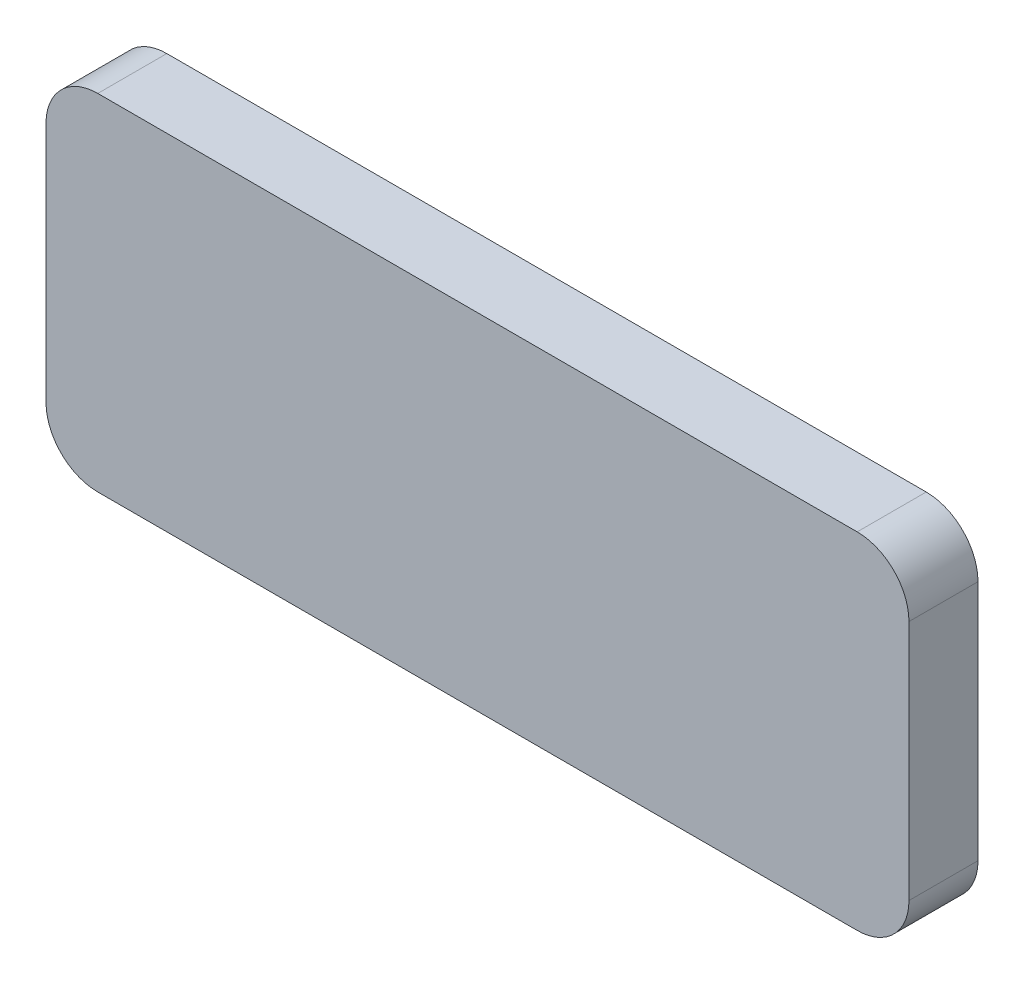
ISO-10303-21;
HEADER;
FILE_DESCRIPTION(('STEP AP214'),'2;1');
FILE_NAME('part.step','',(''),(''),'','','');
FILE_SCHEMA(('AUTOMOTIVE_DESIGN { 1 0 10303 214 1 1 1 1 }'));
ENDSEC;
DATA;
#1=APPLICATION_CONTEXT('core data for automotive mechanical design processes');
#2=APPLICATION_PROTOCOL_DEFINITION('international standard','automotive_design',2000,#1);
#3=PRODUCT_CONTEXT('',#1,'mechanical');
#4=PRODUCT('Part','Part','',(#3));
#5=PRODUCT_RELATED_PRODUCT_CATEGORY('part','',(#4));
#6=PRODUCT_DEFINITION_FORMATION('','',#4);
#7=PRODUCT_DEFINITION_CONTEXT('part definition',#1,'design');
#8=PRODUCT_DEFINITION('design','',#6,#7);
#9=PRODUCT_DEFINITION_SHAPE('','',#8);
#10=(LENGTH_UNIT() NAMED_UNIT(*) SI_UNIT(.MILLI.,.METRE.));
#11=(NAMED_UNIT(*) PLANE_ANGLE_UNIT() SI_UNIT($,.RADIAN.));
#12=(NAMED_UNIT(*) SI_UNIT($,.STERADIAN.) SOLID_ANGLE_UNIT());
#13=UNCERTAINTY_MEASURE_WITH_UNIT(LENGTH_MEASURE(1.E-05),#10,'distance_accuracy_value','');
#14=(GEOMETRIC_REPRESENTATION_CONTEXT(3) GLOBAL_UNCERTAINTY_ASSIGNED_CONTEXT((#13)) GLOBAL_UNIT_ASSIGNED_CONTEXT((#10,
#11,#12)) REPRESENTATION_CONTEXT('',''));
#15=CARTESIAN_POINT('',(0.,0.,0.));
#16=DIRECTION('',(0.,0.,1.));
#17=DIRECTION('',(1.,0.,0.));
#18=AXIS2_PLACEMENT_3D('',#15,#16,#17);
#19=CARTESIAN_POINT('',(22.,55.4011747928363,4.));
#20=DIRECTION('',(0.,0.,-1.));
#21=DIRECTION('',(-1.,0.,0.));
#22=AXIS2_PLACEMENT_3D('',#19,#20,#21);
#23=CYLINDRICAL_SURFACE('',#22,3.);
#24=CARTESIAN_POINT('',(22.,55.4011747928363,0.));
#25=DIRECTION('',(0.,0.,1.));
#26=DIRECTION('',(-1.,0.,0.));
#27=AXIS2_PLACEMENT_3D('',#24,#25,#26);
#28=CIRCLE('',#27,3.);
#29=CARTESIAN_POINT('',(25.,55.4011747928363,0.));
#30=VERTEX_POINT('',#29);
#31=CARTESIAN_POINT('',(22.,58.4011747928363,0.));
#32=VERTEX_POINT('',#31);
#33=EDGE_CURVE('E129',#30,#32,#28,.T.);
#34=ORIENTED_EDGE('',*,*,#33,.T.);
#35=DIRECTION('',(0.,0.,-1.));
#36=VECTOR('',#35,1.);
#37=CARTESIAN_POINT('',(22.,58.4011747928363,4.));
#38=LINE('',#37,#36);
#39=CARTESIAN_POINT('',(22.,58.4011747928363,4.));
#40=VERTEX_POINT('',#39);
#41=EDGE_CURVE('E11',#40,#32,#38,.T.);
#42=ORIENTED_EDGE('',*,*,#41,.F.);
#43=CARTESIAN_POINT('',(22.,55.4011747928363,4.));
#44=DIRECTION('',(0.,0.,1.));
#45=DIRECTION('',(-1.,0.,0.));
#46=AXIS2_PLACEMENT_3D('',#43,#44,#45);
#47=CIRCLE('',#46,3.);
#48=CARTESIAN_POINT('',(25.,55.4011747928363,4.));
#49=VERTEX_POINT('',#48);
#50=EDGE_CURVE('E143',#49,#40,#47,.T.);
#51=ORIENTED_EDGE('',*,*,#50,.F.);
#52=DIRECTION('',(0.,0.,-1.));
#53=VECTOR('',#52,1.);
#54=CARTESIAN_POINT('',(25.,55.4011747928363,4.));
#55=LINE('',#54,#53);
#56=EDGE_CURVE('E125',#49,#30,#55,.T.);
#57=ORIENTED_EDGE('',*,*,#56,.T.);
#58=EDGE_LOOP('',(#34,#42,#51,#57));
#59=FACE_BOUND('',#58,.T.);
#60=ADVANCED_FACE('F33',(#59),#23,.T.);
#61=CARTESIAN_POINT('',(-22.,58.4011747928363,4.));
#62=DIRECTION('',(0.,-1.,0.));
#63=DIRECTION('',(1.,0.,0.));
#64=AXIS2_PLACEMENT_3D('',#61,#62,#63);
#65=PLANE('',#64);
#66=DIRECTION('',(-1.,0.,0.));
#67=VECTOR('',#66,1.);
#68=CARTESIAN_POINT('',(-22.,58.4011747928363,0.));
#69=LINE('',#68,#67);
#70=CARTESIAN_POINT('',(-22.,58.4011747928363,0.));
#71=VERTEX_POINT('',#70);
#72=EDGE_CURVE('E132',#32,#71,#69,.T.);
#73=ORIENTED_EDGE('',*,*,#72,.T.);
#74=DIRECTION('',(0.,0.,-1.));
#75=VECTOR('',#74,1.);
#76=CARTESIAN_POINT('',(-22.,58.4011747928363,4.));
#77=LINE('',#76,#75);
#78=CARTESIAN_POINT('',(-22.,58.4011747928363,4.));
#79=VERTEX_POINT('',#78);
#80=EDGE_CURVE('E41',#79,#71,#77,.T.);
#81=ORIENTED_EDGE('',*,*,#80,.F.);
#82=DIRECTION('',(-1.,0.,0.));
#83=VECTOR('',#82,1.);
#84=CARTESIAN_POINT('',(-22.,58.4011747928363,4.));
#85=LINE('',#84,#83);
#86=EDGE_CURVE('E92',#40,#79,#85,.T.);
#87=ORIENTED_EDGE('',*,*,#86,.F.);
#88=ORIENTED_EDGE('',*,*,#41,.T.);
#89=EDGE_LOOP('',(#73,#81,#87,#88));
#90=FACE_BOUND('',#89,.T.);
#91=ADVANCED_FACE('F178',(#90),#65,.F.);
#92=CARTESIAN_POINT('',(-22.,55.4011747928363,4.));
#93=DIRECTION('',(0.,0.,-1.));
#94=DIRECTION('',(-1.,0.,0.));
#95=AXIS2_PLACEMENT_3D('',#92,#93,#94);
#96=CYLINDRICAL_SURFACE('',#95,3.);
#97=CARTESIAN_POINT('',(-22.,55.4011747928363,0.));
#98=DIRECTION('',(0.,0.,1.));
#99=DIRECTION('',(1.,0.,0.));
#100=AXIS2_PLACEMENT_3D('',#97,#98,#99);
#101=CIRCLE('',#100,3.);
#102=CARTESIAN_POINT('',(-25.,55.4011747928363,0.));
#103=VERTEX_POINT('',#102);
#104=EDGE_CURVE('E134',#71,#103,#101,.T.);
#105=ORIENTED_EDGE('',*,*,#104,.T.);
#106=DIRECTION('',(0.,0.,-1.));
#107=VECTOR('',#106,1.);
#108=CARTESIAN_POINT('',(-25.,55.4011747928363,4.));
#109=LINE('',#108,#107);
#110=CARTESIAN_POINT('',(-25.,55.4011747928363,4.));
#111=VERTEX_POINT('',#110);
#112=EDGE_CURVE('E150',#111,#103,#109,.T.);
#113=ORIENTED_EDGE('',*,*,#112,.F.);
#114=CARTESIAN_POINT('',(-22.,55.4011747928363,4.));
#115=DIRECTION('',(0.,0.,1.));
#116=DIRECTION('',(1.,0.,0.));
#117=AXIS2_PLACEMENT_3D('',#114,#115,#116);
#118=CIRCLE('',#117,3.);
#119=EDGE_CURVE('E158',#79,#111,#118,.T.);
#120=ORIENTED_EDGE('',*,*,#119,.F.);
#121=ORIENTED_EDGE('',*,*,#80,.T.);
#122=EDGE_LOOP('',(#105,#113,#120,#121));
#123=FACE_BOUND('',#122,.T.);
#124=ADVANCED_FACE('F156',(#123),#96,.T.);
#125=CARTESIAN_POINT('',(-25.,55.4011747928363,4.));
#126=DIRECTION('',(1.,0.,0.));
#127=DIRECTION('',(0.,1.,0.));
#128=AXIS2_PLACEMENT_3D('',#125,#126,#127);
#129=PLANE('',#128);
#130=DIRECTION('',(0.,-1.,0.));
#131=VECTOR('',#130,1.);
#132=CARTESIAN_POINT('',(-25.,55.4011747928363,0.));
#133=LINE('',#132,#131);
#134=CARTESIAN_POINT('',(-25.,41.4011747928363,0.));
#135=VERTEX_POINT('',#134);
#136=EDGE_CURVE('E136',#103,#135,#133,.T.);
#137=ORIENTED_EDGE('',*,*,#136,.T.);
#138=DIRECTION('',(0.,0.,-1.));
#139=VECTOR('',#138,1.);
#140=CARTESIAN_POINT('',(-25.,41.4011747928363,4.));
#141=LINE('',#140,#139);
#142=CARTESIAN_POINT('',(-25.,41.4011747928363,4.));
#143=VERTEX_POINT('',#142);
#144=EDGE_CURVE('E147',#143,#135,#141,.T.);
#145=ORIENTED_EDGE('',*,*,#144,.F.);
#146=DIRECTION('',(0.,-1.,0.));
#147=VECTOR('',#146,1.);
#148=CARTESIAN_POINT('',(-25.,55.4011747928363,4.));
#149=LINE('',#148,#147);
#150=EDGE_CURVE('E170',#111,#143,#149,.T.);
#151=ORIENTED_EDGE('',*,*,#150,.F.);
#152=ORIENTED_EDGE('',*,*,#112,.T.);
#153=EDGE_LOOP('',(#137,#145,#151,#152));
#154=FACE_BOUND('',#153,.T.);
#155=ADVANCED_FACE('F166',(#154),#129,.F.);
#156=CARTESIAN_POINT('',(-22.,41.4011747928363,4.));
#157=DIRECTION('',(0.,0.,-1.));
#158=DIRECTION('',(-1.,0.,0.));
#159=AXIS2_PLACEMENT_3D('',#156,#157,#158);
#160=CYLINDRICAL_SURFACE('',#159,3.);
#161=CARTESIAN_POINT('',(-22.,41.4011747928363,0.));
#162=DIRECTION('',(0.,0.,1.));
#163=DIRECTION('',(1.,0.,0.));
#164=AXIS2_PLACEMENT_3D('',#161,#162,#163);
#165=CIRCLE('',#164,3.);
#166=CARTESIAN_POINT('',(-22.,38.4011747928363,0.));
#167=VERTEX_POINT('',#166);
#168=EDGE_CURVE('E138',#135,#167,#165,.T.);
#169=ORIENTED_EDGE('',*,*,#168,.T.);
#170=DIRECTION('',(0.,0.,-1.));
#171=VECTOR('',#170,1.);
#172=CARTESIAN_POINT('',(-22.,38.4011747928363,4.));
#173=LINE('',#172,#171);
#174=CARTESIAN_POINT('',(-22.,38.4011747928363,4.));
#175=VERTEX_POINT('',#174);
#176=EDGE_CURVE('E120',#175,#167,#173,.T.);
#177=ORIENTED_EDGE('',*,*,#176,.F.);
#178=CARTESIAN_POINT('',(-22.,41.4011747928363,4.));
#179=DIRECTION('',(0.,0.,1.));
#180=DIRECTION('',(1.,0.,0.));
#181=AXIS2_PLACEMENT_3D('',#178,#179,#180);
#182=CIRCLE('',#181,3.);
#183=EDGE_CURVE('E111',#143,#175,#182,.T.);
#184=ORIENTED_EDGE('',*,*,#183,.F.);
#185=ORIENTED_EDGE('',*,*,#144,.T.);
#186=EDGE_LOOP('',(#169,#177,#184,#185));
#187=FACE_BOUND('',#186,.T.);
#188=ADVANCED_FACE('F169',(#187),#160,.T.);
#189=CARTESIAN_POINT('',(-22.,38.4011747928363,4.));
#190=DIRECTION('',(0.,1.,0.));
#191=DIRECTION('',(-1.,0.,0.));
#192=AXIS2_PLACEMENT_3D('',#189,#190,#191);
#193=PLANE('',#192);
#194=DIRECTION('',(1.,0.,0.));
#195=VECTOR('',#194,1.);
#196=CARTESIAN_POINT('',(-22.,38.4011747928363,0.));
#197=LINE('',#196,#195);
#198=CARTESIAN_POINT('',(22.,38.4011747928363,0.));
#199=VERTEX_POINT('',#198);
#200=EDGE_CURVE('E119',#167,#199,#197,.T.);
#201=ORIENTED_EDGE('',*,*,#200,.T.);
#202=DIRECTION('',(0.,0.,-1.));
#203=VECTOR('',#202,1.);
#204=CARTESIAN_POINT('',(22.,38.4011747928363,4.));
#205=LINE('',#204,#203);
#206=CARTESIAN_POINT('',(22.,38.4011747928363,4.));
#207=VERTEX_POINT('',#206);
#208=EDGE_CURVE('E116',#207,#199,#205,.T.);
#209=ORIENTED_EDGE('',*,*,#208,.F.);
#210=DIRECTION('',(1.,0.,0.));
#211=VECTOR('',#210,1.);
#212=CARTESIAN_POINT('',(-22.,38.4011747928363,4.));
#213=LINE('',#212,#211);
#214=EDGE_CURVE('E105',#175,#207,#213,.T.);
#215=ORIENTED_EDGE('',*,*,#214,.F.);
#216=ORIENTED_EDGE('',*,*,#176,.T.);
#217=EDGE_LOOP('',(#201,#209,#215,#216));
#218=FACE_BOUND('',#217,.T.);
#219=ADVANCED_FACE('F117',(#218),#193,.F.);
#220=CARTESIAN_POINT('',(22.,41.4011747928363,4.));
#221=DIRECTION('',(0.,0.,-1.));
#222=DIRECTION('',(-1.,0.,0.));
#223=AXIS2_PLACEMENT_3D('',#220,#221,#222);
#224=CYLINDRICAL_SURFACE('',#223,3.);
#225=CARTESIAN_POINT('',(22.,41.4011747928363,0.));
#226=DIRECTION('',(0.,0.,1.));
#227=DIRECTION('',(1.,0.,0.));
#228=AXIS2_PLACEMENT_3D('',#225,#226,#227);
#229=CIRCLE('',#228,3.);
#230=CARTESIAN_POINT('',(25.,41.4011747928363,0.));
#231=VERTEX_POINT('',#230);
#232=EDGE_CURVE('E78',#199,#231,#229,.T.);
#233=ORIENTED_EDGE('',*,*,#232,.T.);
#234=DIRECTION('',(0.,0.,-1.));
#235=VECTOR('',#234,1.);
#236=CARTESIAN_POINT('',(25.,41.4011747928363,4.));
#237=LINE('',#236,#235);
#238=CARTESIAN_POINT('',(25.,41.4011747928363,4.));
#239=VERTEX_POINT('',#238);
#240=EDGE_CURVE('E121',#239,#231,#237,.T.);
#241=ORIENTED_EDGE('',*,*,#240,.F.);
#242=CARTESIAN_POINT('',(22.,41.4011747928363,4.));
#243=DIRECTION('',(0.,0.,1.));
#244=DIRECTION('',(1.,0.,0.));
#245=AXIS2_PLACEMENT_3D('',#242,#243,#244);
#246=CIRCLE('',#245,3.);
#247=EDGE_CURVE('E109',#207,#239,#246,.T.);
#248=ORIENTED_EDGE('',*,*,#247,.F.);
#249=ORIENTED_EDGE('',*,*,#208,.T.);
#250=EDGE_LOOP('',(#233,#241,#248,#249));
#251=FACE_BOUND('',#250,.T.);
#252=ADVANCED_FACE('F123',(#251),#224,.T.);
#253=CARTESIAN_POINT('',(25.,55.4011747928363,4.));
#254=DIRECTION('',(-1.,0.,0.));
#255=DIRECTION('',(0.,0.,1.));
#256=AXIS2_PLACEMENT_3D('',#253,#254,#255);
#257=PLANE('',#256);
#258=DIRECTION('',(0.,1.,0.));
#259=VECTOR('',#258,1.);
#260=CARTESIAN_POINT('',(25.,55.4011747928363,0.));
#261=LINE('',#260,#259);
#262=EDGE_CURVE('E84',#231,#30,#261,.T.);
#263=ORIENTED_EDGE('',*,*,#262,.T.);
#264=ORIENTED_EDGE('',*,*,#56,.F.);
#265=DIRECTION('',(0.,1.,0.));
#266=VECTOR('',#265,1.);
#267=CARTESIAN_POINT('',(25.,55.4011747928363,4.));
#268=LINE('',#267,#266);
#269=EDGE_CURVE('E49',#239,#49,#268,.T.);
#270=ORIENTED_EDGE('',*,*,#269,.F.);
#271=ORIENTED_EDGE('',*,*,#240,.T.);
#272=EDGE_LOOP('',(#263,#264,#270,#271));
#273=FACE_BOUND('',#272,.T.);
#274=ADVANCED_FACE('F194',(#273),#257,.F.);
#275=CARTESIAN_POINT('',(22.,55.4011747928363,4.));
#276=DIRECTION('',(0.,0.,-1.));
#277=DIRECTION('',(-1.,0.,0.));
#278=AXIS2_PLACEMENT_3D('',#275,#276,#277);
#279=PLANE('',#278);
#280=ORIENTED_EDGE('',*,*,#50,.T.);
#281=ORIENTED_EDGE('',*,*,#86,.T.);
#282=ORIENTED_EDGE('',*,*,#119,.T.);
#283=ORIENTED_EDGE('',*,*,#150,.T.);
#284=ORIENTED_EDGE('',*,*,#183,.T.);
#285=ORIENTED_EDGE('',*,*,#214,.T.);
#286=ORIENTED_EDGE('',*,*,#247,.T.);
#287=ORIENTED_EDGE('',*,*,#269,.T.);
#288=EDGE_LOOP('',(#280,#281,#282,#283,#284,#285,#286,#287));
#289=FACE_BOUND('',#288,.T.);
#290=ADVANCED_FACE('F107',(#289),#279,.F.);
#291=CARTESIAN_POINT('',(22.,55.4011747928363,0.));
#292=DIRECTION('',(0.,0.,-1.));
#293=DIRECTION('',(-1.,0.,0.));
#294=AXIS2_PLACEMENT_3D('',#291,#292,#293);
#295=PLANE('',#294);
#296=ORIENTED_EDGE('',*,*,#33,.F.);
#297=ORIENTED_EDGE('',*,*,#262,.F.);
#298=ORIENTED_EDGE('',*,*,#232,.F.);
#299=ORIENTED_EDGE('',*,*,#200,.F.);
#300=ORIENTED_EDGE('',*,*,#168,.F.);
#301=ORIENTED_EDGE('',*,*,#136,.F.);
#302=ORIENTED_EDGE('',*,*,#104,.F.);
#303=ORIENTED_EDGE('',*,*,#72,.F.);
#304=EDGE_LOOP('',(#296,#297,#298,#299,#300,#301,#302,#303));
#305=FACE_BOUND('',#304,.T.);
#306=ADVANCED_FACE('F162',(#305),#295,.T.);
#307=CLOSED_SHELL('',(#60,#91,#124,#155,#188,#219,#252,#274,#290,#306));
#308=MANIFOLD_SOLID_BREP('B2',#307);
#309=ADVANCED_BREP_SHAPE_REPRESENTATION('',(#18,#308),#14);
#310=SHAPE_DEFINITION_REPRESENTATION(#9,#309);
ENDSEC;
END-ISO-10303-21;
